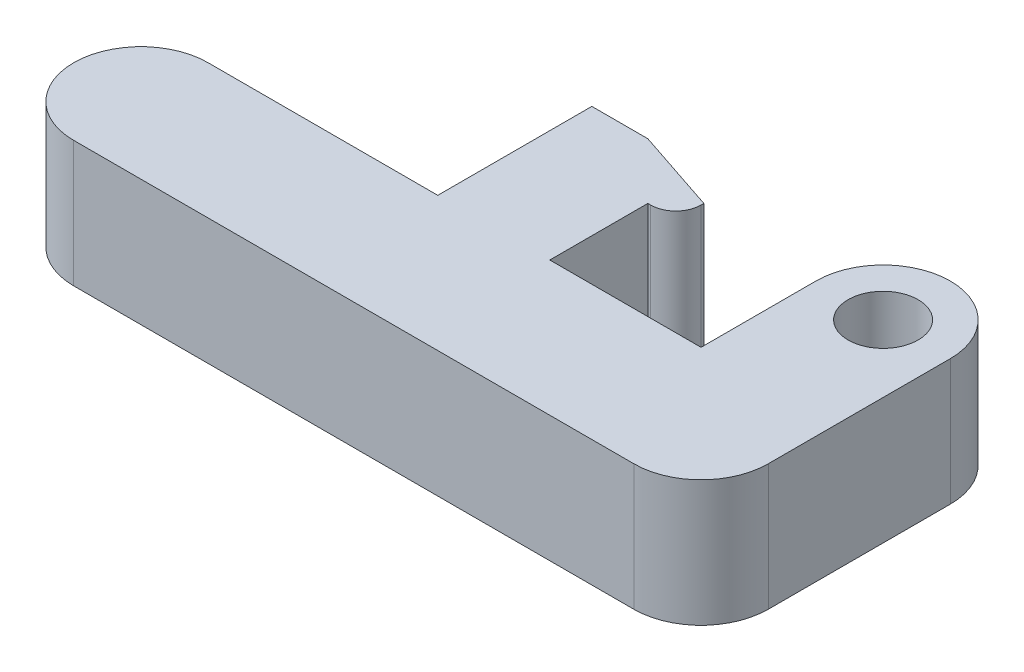
ISO-10303-21;
HEADER;
FILE_DESCRIPTION(('STEP AP214'),'2;1');
FILE_NAME('part.step','',(''),(''),'','','');
FILE_SCHEMA(('AUTOMOTIVE_DESIGN { 1 0 10303 214 1 1 1 1 }'));
ENDSEC;
DATA;
#1=APPLICATION_CONTEXT('core data for automotive mechanical design processes');
#2=APPLICATION_PROTOCOL_DEFINITION('international standard','automotive_design',2000,#1);
#3=PRODUCT_CONTEXT('',#1,'mechanical');
#4=PRODUCT('Part','Part','',(#3));
#5=PRODUCT_RELATED_PRODUCT_CATEGORY('part','',(#4));
#6=PRODUCT_DEFINITION_FORMATION('','',#4);
#7=PRODUCT_DEFINITION_CONTEXT('part definition',#1,'design');
#8=PRODUCT_DEFINITION('design','',#6,#7);
#9=PRODUCT_DEFINITION_SHAPE('','',#8);
#10=(LENGTH_UNIT() NAMED_UNIT(*) SI_UNIT(.MILLI.,.METRE.));
#11=(NAMED_UNIT(*) PLANE_ANGLE_UNIT() SI_UNIT($,.RADIAN.));
#12=(NAMED_UNIT(*) SI_UNIT($,.STERADIAN.) SOLID_ANGLE_UNIT());
#13=UNCERTAINTY_MEASURE_WITH_UNIT(LENGTH_MEASURE(1.E-05),#10,'distance_accuracy_value','');
#14=(GEOMETRIC_REPRESENTATION_CONTEXT(3) GLOBAL_UNCERTAINTY_ASSIGNED_CONTEXT((#13)) GLOBAL_UNIT_ASSIGNED_CONTEXT((#10,
#11,#12)) REPRESENTATION_CONTEXT('',''));
#15=CARTESIAN_POINT('',(0.,0.,0.));
#16=DIRECTION('',(0.,0.,1.));
#17=DIRECTION('',(1.,0.,0.));
#18=AXIS2_PLACEMENT_3D('',#15,#16,#17);
#19=CARTESIAN_POINT('',(0.,4.5,0.6));
#20=DIRECTION('',(0.,0.,-1.));
#21=DIRECTION('',(-1.,0.,0.));
#22=AXIS2_PLACEMENT_3D('',#19,#20,#21);
#23=PLANE('',#22);
#24=DIRECTION('',(1.,0.,0.));
#25=VECTOR('',#24,1.);
#26=CARTESIAN_POINT('',(0.,0.,0.6));
#27=LINE('',#26,#25);
#28=CARTESIAN_POINT('',(-7.8,0.,0.6));
#29=VERTEX_POINT('',#28);
#30=CARTESIAN_POINT('',(-7.7,0.,0.6));
#31=VERTEX_POINT('',#30);
#32=EDGE_CURVE('E194',#29,#31,#27,.T.);
#33=ORIENTED_EDGE('',*,*,#32,.T.);
#34=DIRECTION('',(0.,-1.,0.));
#35=VECTOR('',#34,1.);
#36=CARTESIAN_POINT('',(-7.7,4.5,0.6));
#37=LINE('',#36,#35);
#38=CARTESIAN_POINT('',(-7.7,4.5,0.6));
#39=VERTEX_POINT('',#38);
#40=EDGE_CURVE('E11',#39,#31,#37,.T.);
#41=ORIENTED_EDGE('',*,*,#40,.F.);
#42=DIRECTION('',(1.,0.,0.));
#43=VECTOR('',#42,1.);
#44=CARTESIAN_POINT('',(0.,4.5,0.6));
#45=LINE('',#44,#43);
#46=CARTESIAN_POINT('',(-7.8,4.5,0.6));
#47=VERTEX_POINT('',#46);
#48=EDGE_CURVE('E307',#47,#39,#45,.T.);
#49=ORIENTED_EDGE('',*,*,#48,.F.);
#50=DIRECTION('',(0.,-1.,0.));
#51=VECTOR('',#50,1.);
#52=CARTESIAN_POINT('',(-7.8,4.5,0.6));
#53=LINE('',#52,#51);
#54=EDGE_CURVE('E186',#47,#29,#53,.T.);
#55=ORIENTED_EDGE('',*,*,#54,.T.);
#56=EDGE_LOOP('',(#33,#41,#49,#55));
#57=FACE_BOUND('',#56,.T.);
#58=ADVANCED_FACE('F45',(#57),#23,.F.);
#59=CARTESIAN_POINT('',(-7.7,4.5,-0.3));
#60=DIRECTION('',(0.,-1.,0.));
#61=DIRECTION('',(0.,0.,-1.));
#62=AXIS2_PLACEMENT_3D('',#59,#60,#61);
#63=CYLINDRICAL_SURFACE('',#62,0.9);
#64=CARTESIAN_POINT('',(-7.7,0.,-0.3));
#65=DIRECTION('',(0.,1.,0.));
#66=DIRECTION('',(0.,0.,1.));
#67=AXIS2_PLACEMENT_3D('',#64,#65,#66);
#68=CIRCLE('',#67,0.9);
#69=CARTESIAN_POINT('',(-6.8,0.,-0.3));
#70=VERTEX_POINT('',#69);
#71=EDGE_CURVE('E198',#31,#70,#68,.T.);
#72=ORIENTED_EDGE('',*,*,#71,.T.);
#73=DIRECTION('',(0.,-1.,0.));
#74=VECTOR('',#73,1.);
#75=CARTESIAN_POINT('',(-6.8,4.5,-0.3));
#76=LINE('',#75,#74);
#77=CARTESIAN_POINT('',(-6.8,4.5,-0.3));
#78=VERTEX_POINT('',#77);
#79=EDGE_CURVE('E55',#78,#70,#76,.T.);
#80=ORIENTED_EDGE('',*,*,#79,.F.);
#81=CARTESIAN_POINT('',(-7.7,4.5,-0.3));
#82=DIRECTION('',(0.,1.,0.));
#83=DIRECTION('',(0.,0.,1.));
#84=AXIS2_PLACEMENT_3D('',#81,#82,#83);
#85=CIRCLE('',#84,0.9);
#86=EDGE_CURVE('E127',#39,#78,#85,.T.);
#87=ORIENTED_EDGE('',*,*,#86,.F.);
#88=ORIENTED_EDGE('',*,*,#40,.T.);
#89=EDGE_LOOP('',(#72,#80,#87,#88));
#90=FACE_BOUND('',#89,.T.);
#91=ADVANCED_FACE('F287',(#90),#63,.T.);
#92=CARTESIAN_POINT('',(-6.8,4.5,0.));
#93=DIRECTION('',(1.,0.,0.));
#94=DIRECTION('',(0.,0.,-1.));
#95=AXIS2_PLACEMENT_3D('',#92,#93,#94);
#96=PLANE('',#95);
#97=DIRECTION('',(0.,0.,1.));
#98=VECTOR('',#97,1.);
#99=CARTESIAN_POINT('',(-6.8,0.,0.));
#100=LINE('',#99,#98);
#101=CARTESIAN_POINT('',(-6.8,0.,-0.4));
#102=VERTEX_POINT('',#101);
#103=EDGE_CURVE('E202',#102,#70,#100,.T.);
#104=ORIENTED_EDGE('',*,*,#103,.F.);
#105=DIRECTION('',(0.,-1.,0.));
#106=VECTOR('',#105,1.);
#107=CARTESIAN_POINT('',(-6.8,4.5,-0.4));
#108=LINE('',#107,#106);
#109=CARTESIAN_POINT('',(-6.8,4.5,-0.4));
#110=VERTEX_POINT('',#109);
#111=EDGE_CURVE('E278',#110,#102,#108,.T.);
#112=ORIENTED_EDGE('',*,*,#111,.F.);
#113=DIRECTION('',(0.,0.,1.));
#114=VECTOR('',#113,1.);
#115=CARTESIAN_POINT('',(-6.8,4.5,0.));
#116=LINE('',#115,#114);
#117=EDGE_CURVE('E286',#110,#78,#116,.T.);
#118=ORIENTED_EDGE('',*,*,#117,.T.);
#119=ORIENTED_EDGE('',*,*,#79,.T.);
#120=EDGE_LOOP('',(#104,#112,#118,#119));
#121=FACE_BOUND('',#120,.T.);
#122=ADVANCED_FACE('F284',(#121),#96,.T.);
#123=CARTESIAN_POINT('',(-0.559999999999999,4.5,1.68));
#124=DIRECTION('',(0.316227766016838,0.,-0.948683298050514));
#125=DIRECTION('',(-0.948683298050514,0.,-0.316227766016838));
#126=AXIS2_PLACEMENT_3D('',#123,#124,#125);
#127=PLANE('',#126);
#128=DIRECTION('',(0.948683298050514,0.,0.316227766016838));
#129=VECTOR('',#128,1.);
#130=CARTESIAN_POINT('',(-0.559999999999999,0.,1.68));
#131=LINE('',#130,#129);
#132=CARTESIAN_POINT('',(-9.8,0.,-1.4));
#133=VERTEX_POINT('',#132);
#134=EDGE_CURVE('E206',#133,#102,#131,.T.);
#135=ORIENTED_EDGE('',*,*,#134,.F.);
#136=DIRECTION('',(0.,-1.,0.));
#137=VECTOR('',#136,1.);
#138=CARTESIAN_POINT('',(-9.8,4.5,-1.4));
#139=LINE('',#138,#137);
#140=CARTESIAN_POINT('',(-9.8,4.5,-1.4));
#141=VERTEX_POINT('',#140);
#142=EDGE_CURVE('E275',#141,#133,#139,.T.);
#143=ORIENTED_EDGE('',*,*,#142,.F.);
#144=DIRECTION('',(0.948683298050514,0.,0.316227766016838));
#145=VECTOR('',#144,1.);
#146=CARTESIAN_POINT('',(-0.559999999999999,4.5,1.68));
#147=LINE('',#146,#145);
#148=EDGE_CURVE('E300',#141,#110,#147,.T.);
#149=ORIENTED_EDGE('',*,*,#148,.T.);
#150=ORIENTED_EDGE('',*,*,#111,.T.);
#151=EDGE_LOOP('',(#135,#143,#149,#150));
#152=FACE_BOUND('',#151,.T.);
#153=ADVANCED_FACE('F296',(#152),#127,.T.);
#154=CARTESIAN_POINT('',(0.,4.5,-1.4));
#155=DIRECTION('',(0.,0.,1.));
#156=DIRECTION('',(1.,0.,0.));
#157=AXIS2_PLACEMENT_3D('',#154,#155,#156);
#158=PLANE('',#157);
#159=DIRECTION('',(-1.,0.,0.));
#160=VECTOR('',#159,1.);
#161=CARTESIAN_POINT('',(0.,0.,-1.4));
#162=LINE('',#161,#160);
#163=CARTESIAN_POINT('',(-11.8,0.,-1.4));
#164=VERTEX_POINT('',#163);
#165=EDGE_CURVE('E210',#133,#164,#162,.T.);
#166=ORIENTED_EDGE('',*,*,#165,.T.);
#167=DIRECTION('',(0.,-1.,0.));
#168=VECTOR('',#167,1.);
#169=CARTESIAN_POINT('',(-11.8,4.5,-1.4));
#170=LINE('',#169,#168);
#171=CARTESIAN_POINT('',(-11.8,4.5,-1.4));
#172=VERTEX_POINT('',#171);
#173=EDGE_CURVE('E271',#172,#164,#170,.T.);
#174=ORIENTED_EDGE('',*,*,#173,.F.);
#175=DIRECTION('',(-1.,0.,0.));
#176=VECTOR('',#175,1.);
#177=CARTESIAN_POINT('',(0.,4.5,-1.4));
#178=LINE('',#177,#176);
#179=EDGE_CURVE('E305',#141,#172,#178,.T.);
#180=ORIENTED_EDGE('',*,*,#179,.F.);
#181=ORIENTED_EDGE('',*,*,#142,.T.);
#182=EDGE_LOOP('',(#166,#174,#180,#181));
#183=FACE_BOUND('',#182,.T.);
#184=ADVANCED_FACE('F365',(#183),#158,.F.);
#185=CARTESIAN_POINT('',(-11.8,4.5,0.));
#186=DIRECTION('',(1.,0.,0.));
#187=DIRECTION('',(0.,0.,-1.));
#188=AXIS2_PLACEMENT_3D('',#185,#186,#187);
#189=PLANE('',#188);
#190=DIRECTION('',(0.,0.,1.));
#191=VECTOR('',#190,1.);
#192=CARTESIAN_POINT('',(-11.8,0.,0.));
#193=LINE('',#192,#191);
#194=CARTESIAN_POINT('',(-11.8,0.,4.1));
#195=VERTEX_POINT('',#194);
#196=EDGE_CURVE('E213',#164,#195,#193,.T.);
#197=ORIENTED_EDGE('',*,*,#196,.T.);
#198=DIRECTION('',(0.,-1.,0.));
#199=VECTOR('',#198,1.);
#200=CARTESIAN_POINT('',(-11.8,4.5,4.1));
#201=LINE('',#200,#199);
#202=CARTESIAN_POINT('',(-11.8,4.5,4.1));
#203=VERTEX_POINT('',#202);
#204=EDGE_CURVE('E267',#203,#195,#201,.T.);
#205=ORIENTED_EDGE('',*,*,#204,.F.);
#206=DIRECTION('',(0.,0.,1.));
#207=VECTOR('',#206,1.);
#208=CARTESIAN_POINT('',(-11.8,4.5,0.));
#209=LINE('',#208,#207);
#210=EDGE_CURVE('E313',#172,#203,#209,.T.);
#211=ORIENTED_EDGE('',*,*,#210,.F.);
#212=ORIENTED_EDGE('',*,*,#173,.T.);
#213=EDGE_LOOP('',(#197,#205,#211,#212));
#214=FACE_BOUND('',#213,.T.);
#215=ADVANCED_FACE('F368',(#214),#189,.F.);
#216=CARTESIAN_POINT('',(0.,4.5,4.1));
#217=DIRECTION('',(0.,0.,1.));
#218=DIRECTION('',(1.,0.,0.));
#219=AXIS2_PLACEMENT_3D('',#216,#217,#218);
#220=PLANE('',#219);
#221=DIRECTION('',(-1.,0.,0.));
#222=VECTOR('',#221,1.);
#223=CARTESIAN_POINT('',(0.,0.,4.1));
#224=LINE('',#223,#222);
#225=CARTESIAN_POINT('',(-20.,0.,4.1));
#226=VERTEX_POINT('',#225);
#227=EDGE_CURVE('E216',#195,#226,#224,.T.);
#228=ORIENTED_EDGE('',*,*,#227,.T.);
#229=DIRECTION('',(0.,-1.,0.));
#230=VECTOR('',#229,1.);
#231=CARTESIAN_POINT('',(-20.,4.5,4.1));
#232=LINE('',#231,#230);
#233=CARTESIAN_POINT('',(-20.,4.5,4.1));
#234=VERTEX_POINT('',#233);
#235=EDGE_CURVE('E263',#234,#226,#232,.T.);
#236=ORIENTED_EDGE('',*,*,#235,.F.);
#237=DIRECTION('',(-1.,0.,0.));
#238=VECTOR('',#237,1.);
#239=CARTESIAN_POINT('',(0.,4.5,4.1));
#240=LINE('',#239,#238);
#241=EDGE_CURVE('E316',#203,#234,#240,.T.);
#242=ORIENTED_EDGE('',*,*,#241,.F.);
#243=ORIENTED_EDGE('',*,*,#204,.T.);
#244=EDGE_LOOP('',(#228,#236,#242,#243));
#245=FACE_BOUND('',#244,.T.);
#246=ADVANCED_FACE('F372',(#245),#220,.F.);
#247=CARTESIAN_POINT('',(-20.,4.5,6.5));
#248=DIRECTION('',(0.,-1.,0.));
#249=DIRECTION('',(0.,0.,-1.));
#250=AXIS2_PLACEMENT_3D('',#247,#248,#249);
#251=CYLINDRICAL_SURFACE('',#250,2.4);
#252=CARTESIAN_POINT('',(-20.,0.,6.5));
#253=DIRECTION('',(0.,1.,0.));
#254=DIRECTION('',(0.,0.,1.));
#255=AXIS2_PLACEMENT_3D('',#252,#253,#254);
#256=CIRCLE('',#255,2.4);
#257=CARTESIAN_POINT('',(-20.,0.,8.9));
#258=VERTEX_POINT('',#257);
#259=EDGE_CURVE('E219',#226,#258,#256,.T.);
#260=ORIENTED_EDGE('',*,*,#259,.T.);
#261=DIRECTION('',(0.,-1.,0.));
#262=VECTOR('',#261,1.);
#263=CARTESIAN_POINT('',(-20.,4.5,8.9));
#264=LINE('',#263,#262);
#265=CARTESIAN_POINT('',(-20.,4.5,8.9));
#266=VERTEX_POINT('',#265);
#267=EDGE_CURVE('E260',#266,#258,#264,.T.);
#268=ORIENTED_EDGE('',*,*,#267,.F.);
#269=CARTESIAN_POINT('',(-20.,4.5,6.5));
#270=DIRECTION('',(0.,1.,0.));
#271=DIRECTION('',(0.,0.,1.));
#272=AXIS2_PLACEMENT_3D('',#269,#270,#271);
#273=CIRCLE('',#272,2.4);
#274=EDGE_CURVE('E319',#234,#266,#273,.T.);
#275=ORIENTED_EDGE('',*,*,#274,.F.);
#276=ORIENTED_EDGE('',*,*,#235,.T.);
#277=EDGE_LOOP('',(#260,#268,#275,#276));
#278=FACE_BOUND('',#277,.T.);
#279=ADVANCED_FACE('F376',(#278),#251,.T.);
#280=CARTESIAN_POINT('',(0.,4.5,8.9));
#281=DIRECTION('',(0.,0.,1.));
#282=DIRECTION('',(1.,0.,0.));
#283=AXIS2_PLACEMENT_3D('',#280,#281,#282);
#284=PLANE('',#283);
#285=DIRECTION('',(-1.,0.,0.));
#286=VECTOR('',#285,1.);
#287=CARTESIAN_POINT('',(0.,0.,8.9));
#288=LINE('',#287,#286);
#289=CARTESIAN_POINT('',(0.,0.,8.9));
#290=VERTEX_POINT('',#289);
#291=EDGE_CURVE('E223',#290,#258,#288,.T.);
#292=ORIENTED_EDGE('',*,*,#291,.F.);
#293=DIRECTION('',(0.,-1.,0.));
#294=VECTOR('',#293,1.);
#295=CARTESIAN_POINT('',(0.,4.5,8.9));
#296=LINE('',#295,#294);
#297=CARTESIAN_POINT('',(0.,4.5,8.9));
#298=VERTEX_POINT('',#297);
#299=EDGE_CURVE('E257',#298,#290,#296,.T.);
#300=ORIENTED_EDGE('',*,*,#299,.F.);
#301=DIRECTION('',(-1.,0.,0.));
#302=VECTOR('',#301,1.);
#303=CARTESIAN_POINT('',(0.,4.5,8.9));
#304=LINE('',#303,#302);
#305=EDGE_CURVE('E322',#298,#266,#304,.T.);
#306=ORIENTED_EDGE('',*,*,#305,.T.);
#307=ORIENTED_EDGE('',*,*,#267,.T.);
#308=EDGE_LOOP('',(#292,#300,#306,#307));
#309=FACE_BOUND('',#308,.T.);
#310=ADVANCED_FACE('F380',(#309),#284,.T.);
#311=CARTESIAN_POINT('',(0.,4.5,6.5));
#312=DIRECTION('',(0.,-1.,0.));
#313=DIRECTION('',(0.,0.,-1.));
#314=AXIS2_PLACEMENT_3D('',#311,#312,#313);
#315=CYLINDRICAL_SURFACE('',#314,2.4);
#316=CARTESIAN_POINT('',(0.,0.,6.5));
#317=DIRECTION('',(0.,1.,0.));
#318=DIRECTION('',(0.,0.,1.));
#319=AXIS2_PLACEMENT_3D('',#316,#317,#318);
#320=CIRCLE('',#319,2.4);
#321=CARTESIAN_POINT('',(2.4,0.,6.5));
#322=VERTEX_POINT('',#321);
#323=EDGE_CURVE('E227',#290,#322,#320,.T.);
#324=ORIENTED_EDGE('',*,*,#323,.T.);
#325=DIRECTION('',(0.,-1.,0.));
#326=VECTOR('',#325,1.);
#327=CARTESIAN_POINT('',(2.4,4.5,6.5));
#328=LINE('',#327,#326);
#329=CARTESIAN_POINT('',(2.4,4.5,6.5));
#330=VERTEX_POINT('',#329);
#331=EDGE_CURVE('E254',#330,#322,#328,.T.);
#332=ORIENTED_EDGE('',*,*,#331,.F.);
#333=CARTESIAN_POINT('',(0.,4.5,6.5));
#334=DIRECTION('',(0.,1.,0.));
#335=DIRECTION('',(0.,0.,1.));
#336=AXIS2_PLACEMENT_3D('',#333,#334,#335);
#337=CIRCLE('',#336,2.4);
#338=EDGE_CURVE('E326',#298,#330,#337,.T.);
#339=ORIENTED_EDGE('',*,*,#338,.F.);
#340=ORIENTED_EDGE('',*,*,#299,.T.);
#341=EDGE_LOOP('',(#324,#332,#339,#340));
#342=FACE_BOUND('',#341,.T.);
#343=ADVANCED_FACE('F340',(#342),#315,.T.);
#344=CARTESIAN_POINT('',(2.4,4.5,0.));
#345=DIRECTION('',(1.,0.,0.));
#346=DIRECTION('',(0.,0.,-1.));
#347=AXIS2_PLACEMENT_3D('',#344,#345,#346);
#348=PLANE('',#347);
#349=DIRECTION('',(0.,0.,1.));
#350=VECTOR('',#349,1.);
#351=CARTESIAN_POINT('',(2.4,0.,0.));
#352=LINE('',#351,#350);
#353=CARTESIAN_POINT('',(2.4,0.,0.));
#354=VERTEX_POINT('',#353);
#355=EDGE_CURVE('E231',#354,#322,#352,.T.);
#356=ORIENTED_EDGE('',*,*,#355,.F.);
#357=DIRECTION('',(0.,-1.,0.));
#358=VECTOR('',#357,1.);
#359=CARTESIAN_POINT('',(2.4,4.5,0.));
#360=LINE('',#359,#358);
#361=CARTESIAN_POINT('',(2.4,4.5,0.));
#362=VERTEX_POINT('',#361);
#363=EDGE_CURVE('E251',#362,#354,#360,.T.);
#364=ORIENTED_EDGE('',*,*,#363,.F.);
#365=DIRECTION('',(0.,0.,1.));
#366=VECTOR('',#365,1.);
#367=CARTESIAN_POINT('',(2.4,4.5,0.));
#368=LINE('',#367,#366);
#369=EDGE_CURVE('E329',#362,#330,#368,.T.);
#370=ORIENTED_EDGE('',*,*,#369,.T.);
#371=ORIENTED_EDGE('',*,*,#331,.T.);
#372=EDGE_LOOP('',(#356,#364,#370,#371));
#373=FACE_BOUND('',#372,.T.);
#374=ADVANCED_FACE('F335',(#373),#348,.T.);
#375=CARTESIAN_POINT('',(0.,4.5,0.));
#376=DIRECTION('',(0.,-1.,0.));
#377=DIRECTION('',(0.,0.,-1.));
#378=AXIS2_PLACEMENT_3D('',#375,#376,#377);
#379=CYLINDRICAL_SURFACE('',#378,2.4);
#380=CARTESIAN_POINT('',(0.,0.,0.));
#381=DIRECTION('',(0.,1.,0.));
#382=DIRECTION('',(0.,0.,1.));
#383=AXIS2_PLACEMENT_3D('',#380,#381,#382);
#384=CIRCLE('',#383,2.4);
#385=CARTESIAN_POINT('',(-2.4,0.,0.));
#386=VERTEX_POINT('',#385);
#387=EDGE_CURVE('E235',#354,#386,#384,.T.);
#388=ORIENTED_EDGE('',*,*,#387,.T.);
#389=DIRECTION('',(0.,-1.,0.));
#390=VECTOR('',#389,1.);
#391=CARTESIAN_POINT('',(-2.4,4.5,0.));
#392=LINE('',#391,#390);
#393=CARTESIAN_POINT('',(-2.4,4.5,0.));
#394=VERTEX_POINT('',#393);
#395=EDGE_CURVE('E179',#394,#386,#392,.T.);
#396=ORIENTED_EDGE('',*,*,#395,.F.);
#397=CARTESIAN_POINT('',(0.,4.5,0.));
#398=DIRECTION('',(0.,1.,0.));
#399=DIRECTION('',(0.,0.,1.));
#400=AXIS2_PLACEMENT_3D('',#397,#398,#399);
#401=CIRCLE('',#400,2.4);
#402=EDGE_CURVE('E168',#362,#394,#401,.T.);
#403=ORIENTED_EDGE('',*,*,#402,.F.);
#404=ORIENTED_EDGE('',*,*,#363,.T.);
#405=EDGE_LOOP('',(#388,#396,#403,#404));
#406=FACE_BOUND('',#405,.T.);
#407=ADVANCED_FACE('F345',(#406),#379,.T.);
#408=CARTESIAN_POINT('',(-2.4,4.5,0.));
#409=DIRECTION('',(1.,0.,0.));
#410=DIRECTION('',(0.,0.,-1.));
#411=AXIS2_PLACEMENT_3D('',#408,#409,#410);
#412=PLANE('',#411);
#413=DIRECTION('',(0.,0.,1.));
#414=VECTOR('',#413,1.);
#415=CARTESIAN_POINT('',(-2.4,0.,0.));
#416=LINE('',#415,#414);
#417=CARTESIAN_POINT('',(-2.4,0.,4.1));
#418=VERTEX_POINT('',#417);
#419=EDGE_CURVE('E177',#386,#418,#416,.T.);
#420=ORIENTED_EDGE('',*,*,#419,.T.);
#421=DIRECTION('',(0.,-1.,0.));
#422=VECTOR('',#421,1.);
#423=CARTESIAN_POINT('',(-2.4,4.5,4.1));
#424=LINE('',#423,#422);
#425=CARTESIAN_POINT('',(-2.4,4.5,4.1));
#426=VERTEX_POINT('',#425);
#427=EDGE_CURVE('E174',#426,#418,#424,.T.);
#428=ORIENTED_EDGE('',*,*,#427,.F.);
#429=DIRECTION('',(0.,0.,1.));
#430=VECTOR('',#429,1.);
#431=CARTESIAN_POINT('',(-2.4,4.5,0.));
#432=LINE('',#431,#430);
#433=EDGE_CURVE('E161',#394,#426,#432,.T.);
#434=ORIENTED_EDGE('',*,*,#433,.F.);
#435=ORIENTED_EDGE('',*,*,#395,.T.);
#436=EDGE_LOOP('',(#420,#428,#434,#435));
#437=FACE_BOUND('',#436,.T.);
#438=ADVANCED_FACE('F175',(#437),#412,.F.);
#439=CARTESIAN_POINT('',(0.,4.5,4.1));
#440=DIRECTION('',(0.,0.,1.));
#441=DIRECTION('',(1.,0.,0.));
#442=AXIS2_PLACEMENT_3D('',#439,#440,#441);
#443=PLANE('',#442);
#444=DIRECTION('',(-1.,0.,0.));
#445=VECTOR('',#444,1.);
#446=CARTESIAN_POINT('',(0.,0.,4.1));
#447=LINE('',#446,#445);
#448=CARTESIAN_POINT('',(-7.8,0.,4.1));
#449=VERTEX_POINT('',#448);
#450=EDGE_CURVE('E113',#418,#449,#447,.T.);
#451=ORIENTED_EDGE('',*,*,#450,.T.);
#452=DIRECTION('',(0.,-1.,0.));
#453=VECTOR('',#452,1.);
#454=CARTESIAN_POINT('',(-7.8,4.5,4.1));
#455=LINE('',#454,#453);
#456=CARTESIAN_POINT('',(-7.8,4.5,4.1));
#457=VERTEX_POINT('',#456);
#458=EDGE_CURVE('E180',#457,#449,#455,.T.);
#459=ORIENTED_EDGE('',*,*,#458,.F.);
#460=DIRECTION('',(-1.,0.,0.));
#461=VECTOR('',#460,1.);
#462=CARTESIAN_POINT('',(0.,4.5,4.1));
#463=LINE('',#462,#461);
#464=EDGE_CURVE('E165',#426,#457,#463,.T.);
#465=ORIENTED_EDGE('',*,*,#464,.F.);
#466=ORIENTED_EDGE('',*,*,#427,.T.);
#467=EDGE_LOOP('',(#451,#459,#465,#466));
#468=FACE_BOUND('',#467,.T.);
#469=ADVANCED_FACE('F182',(#468),#443,.F.);
#470=CARTESIAN_POINT('',(0.,4.5,0.));
#471=DIRECTION('',(0.,-1.,0.));
#472=DIRECTION('',(0.,0.,-1.));
#473=AXIS2_PLACEMENT_3D('',#470,#471,#472);
#474=CYLINDRICAL_SURFACE('',#473,1.25);
#475=CARTESIAN_POINT('',(0.,4.5,0.));
#476=DIRECTION('',(0.,1.,0.));
#477=DIRECTION('',(0.,0.,1.));
#478=AXIS2_PLACEMENT_3D('',#475,#476,#477);
#479=CIRCLE('',#478,1.25);
#480=CARTESIAN_POINT('',(0.,4.5,1.25));
#481=VERTEX_POINT('',#480);
#482=EDGE_CURVE('E244',#481,#481,#479,.T.);
#483=ORIENTED_EDGE('',*,*,#482,.T.);
#484=EDGE_LOOP('',(#483));
#485=FACE_BOUND('',#484,.T.);
#486=CARTESIAN_POINT('',(0.,0.,0.));
#487=DIRECTION('',(0.,1.,0.));
#488=DIRECTION('',(0.,0.,1.));
#489=AXIS2_PLACEMENT_3D('',#486,#487,#488);
#490=CIRCLE('',#489,1.25);
#491=CARTESIAN_POINT('',(0.,0.,1.25));
#492=VERTEX_POINT('',#491);
#493=EDGE_CURVE('E190',#492,#492,#490,.T.);
#494=ORIENTED_EDGE('',*,*,#493,.F.);
#495=EDGE_LOOP('',(#494));
#496=FACE_BOUND('',#495,.T.);
#497=ADVANCED_FACE('F47',(#485,#496),#474,.F.);
#498=CARTESIAN_POINT('',(-7.8,4.5,0.));
#499=DIRECTION('',(-1.,0.,0.));
#500=DIRECTION('',(0.,0.,1.));
#501=AXIS2_PLACEMENT_3D('',#498,#499,#500);
#502=PLANE('',#501);
#503=DIRECTION('',(0.,0.,-1.));
#504=VECTOR('',#503,1.);
#505=CARTESIAN_POINT('',(-7.8,0.,0.));
#506=LINE('',#505,#504);
#507=EDGE_CURVE('E119',#449,#29,#506,.T.);
#508=ORIENTED_EDGE('',*,*,#507,.T.);
#509=ORIENTED_EDGE('',*,*,#54,.F.);
#510=DIRECTION('',(0.,0.,-1.));
#511=VECTOR('',#510,1.);
#512=CARTESIAN_POINT('',(-7.8,4.5,0.));
#513=LINE('',#512,#511);
#514=EDGE_CURVE('E63',#457,#47,#513,.T.);
#515=ORIENTED_EDGE('',*,*,#514,.F.);
#516=ORIENTED_EDGE('',*,*,#458,.T.);
#517=EDGE_LOOP('',(#508,#509,#515,#516));
#518=FACE_BOUND('',#517,.T.);
#519=ADVANCED_FACE('F425',(#518),#502,.F.);
#520=CARTESIAN_POINT('',(0.,4.5,0.));
#521=DIRECTION('',(0.,1.,0.));
#522=DIRECTION('',(0.,0.,1.));
#523=AXIS2_PLACEMENT_3D('',#520,#521,#522);
#524=PLANE('',#523);
#525=ORIENTED_EDGE('',*,*,#482,.F.);
#526=EDGE_LOOP('',(#525));
#527=FACE_BOUND('',#526,.T.);
#528=ORIENTED_EDGE('',*,*,#48,.T.);
#529=ORIENTED_EDGE('',*,*,#86,.T.);
#530=ORIENTED_EDGE('',*,*,#117,.F.);
#531=ORIENTED_EDGE('',*,*,#148,.F.);
#532=ORIENTED_EDGE('',*,*,#179,.T.);
#533=ORIENTED_EDGE('',*,*,#210,.T.);
#534=ORIENTED_EDGE('',*,*,#241,.T.);
#535=ORIENTED_EDGE('',*,*,#274,.T.);
#536=ORIENTED_EDGE('',*,*,#305,.F.);
#537=ORIENTED_EDGE('',*,*,#338,.T.);
#538=ORIENTED_EDGE('',*,*,#369,.F.);
#539=ORIENTED_EDGE('',*,*,#402,.T.);
#540=ORIENTED_EDGE('',*,*,#433,.T.);
#541=ORIENTED_EDGE('',*,*,#464,.T.);
#542=ORIENTED_EDGE('',*,*,#514,.T.);
#543=EDGE_LOOP('',(#528,#529,#530,#531,#532,#533,#534,#535,#536,#537,#538,#539,#540,#541,#542));
#544=FACE_BOUND('',#543,.T.);
#545=ADVANCED_FACE('F163',(#527,#544),#524,.T.);
#546=CARTESIAN_POINT('',(0.,0.,0.));
#547=DIRECTION('',(0.,1.,0.));
#548=DIRECTION('',(0.,0.,1.));
#549=AXIS2_PLACEMENT_3D('',#546,#547,#548);
#550=PLANE('',#549);
#551=ORIENTED_EDGE('',*,*,#493,.T.);
#552=EDGE_LOOP('',(#551));
#553=FACE_BOUND('',#552,.T.);
#554=ORIENTED_EDGE('',*,*,#32,.F.);
#555=ORIENTED_EDGE('',*,*,#507,.F.);
#556=ORIENTED_EDGE('',*,*,#450,.F.);
#557=ORIENTED_EDGE('',*,*,#419,.F.);
#558=ORIENTED_EDGE('',*,*,#387,.F.);
#559=ORIENTED_EDGE('',*,*,#355,.T.);
#560=ORIENTED_EDGE('',*,*,#323,.F.);
#561=ORIENTED_EDGE('',*,*,#291,.T.);
#562=ORIENTED_EDGE('',*,*,#259,.F.);
#563=ORIENTED_EDGE('',*,*,#227,.F.);
#564=ORIENTED_EDGE('',*,*,#196,.F.);
#565=ORIENTED_EDGE('',*,*,#165,.F.);
#566=ORIENTED_EDGE('',*,*,#134,.T.);
#567=ORIENTED_EDGE('',*,*,#103,.T.);
#568=ORIENTED_EDGE('',*,*,#71,.F.);
#569=EDGE_LOOP('',(#554,#555,#556,#557,#558,#559,#560,#561,#562,#563,#564,#565,#566,#567,#568));
#570=FACE_BOUND('',#569,.T.);
#571=ADVANCED_FACE('F291',(#553,#570),#550,.F.);
#572=CLOSED_SHELL('',(#58,#91,#122,#153,#184,#215,#246,#279,#310,#343,#374,#407,#438,#469,#497,
#519,#545,#571));
#573=MANIFOLD_SOLID_BREP('B2',#572);
#574=ADVANCED_BREP_SHAPE_REPRESENTATION('',(#18,#573),#14);
#575=SHAPE_DEFINITION_REPRESENTATION(#9,#574);
ENDSEC;
END-ISO-10303-21;
